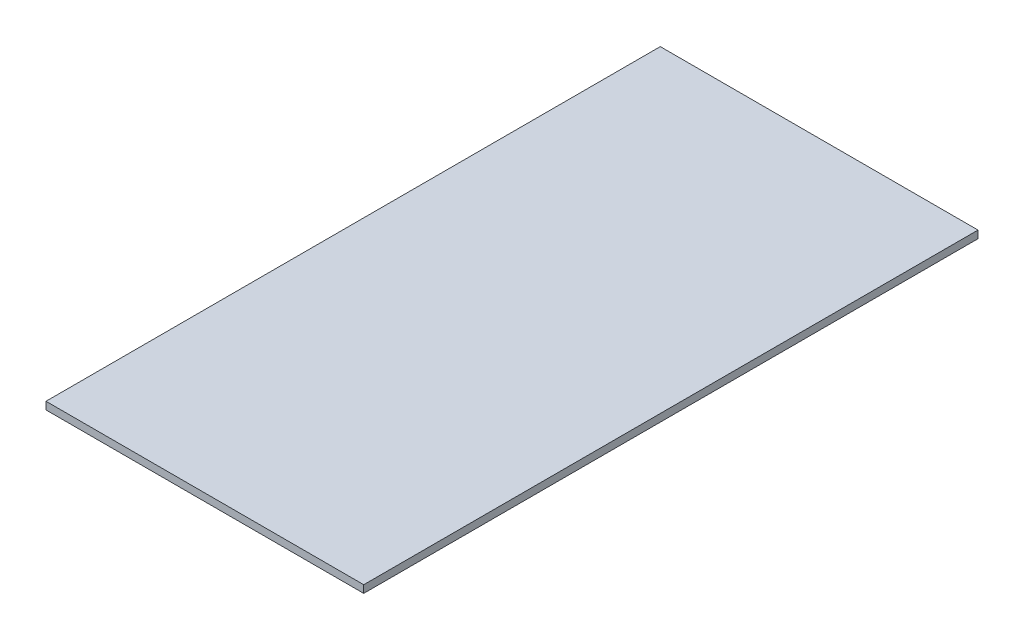
ISO-10303-21;
HEADER;
FILE_DESCRIPTION(('STEP AP214'),'2;1');
FILE_NAME('part.step','',(''),(''),'','','');
FILE_SCHEMA(('AUTOMOTIVE_DESIGN { 1 0 10303 214 1 1 1 1 }'));
ENDSEC;
DATA;
#1=APPLICATION_CONTEXT('core data for automotive mechanical design processes');
#2=APPLICATION_PROTOCOL_DEFINITION('international standard','automotive_design',2000,#1);
#3=PRODUCT_CONTEXT('',#1,'mechanical');
#4=PRODUCT('Part','Part','',(#3));
#5=PRODUCT_RELATED_PRODUCT_CATEGORY('part','',(#4));
#6=PRODUCT_DEFINITION_FORMATION('','',#4);
#7=PRODUCT_DEFINITION_CONTEXT('part definition',#1,'design');
#8=PRODUCT_DEFINITION('design','',#6,#7);
#9=PRODUCT_DEFINITION_SHAPE('','',#8);
#10=(LENGTH_UNIT() NAMED_UNIT(*) SI_UNIT(.MILLI.,.METRE.));
#11=(NAMED_UNIT(*) PLANE_ANGLE_UNIT() SI_UNIT($,.RADIAN.));
#12=(NAMED_UNIT(*) SI_UNIT($,.STERADIAN.) SOLID_ANGLE_UNIT());
#13=UNCERTAINTY_MEASURE_WITH_UNIT(LENGTH_MEASURE(1.E-05),#10,'distance_accuracy_value','');
#14=(GEOMETRIC_REPRESENTATION_CONTEXT(3) GLOBAL_UNCERTAINTY_ASSIGNED_CONTEXT((#13)) GLOBAL_UNIT_ASSIGNED_CONTEXT((#10,
#11,#12)) REPRESENTATION_CONTEXT('',''));
#15=CARTESIAN_POINT('',(0.,0.,0.));
#16=DIRECTION('',(0.,0.,1.));
#17=DIRECTION('',(1.,0.,0.));
#18=AXIS2_PLACEMENT_3D('',#15,#16,#17);
#19=CARTESIAN_POINT('',(150.,7.112,0.));
#20=DIRECTION('',(-1.,0.,0.));
#21=DIRECTION('',(0.,0.,1.));
#22=AXIS2_PLACEMENT_3D('',#19,#20,#21);
#23=PLANE('',#22);
#24=DIRECTION('',(0.,0.,-1.));
#25=VECTOR('',#24,1.);
#26=CARTESIAN_POINT('',(150.,0.,0.));
#27=LINE('',#26,#25);
#28=CARTESIAN_POINT('',(150.,0.,0.));
#29=VERTEX_POINT('',#28);
#30=CARTESIAN_POINT('',(150.,0.,-580.));
#31=VERTEX_POINT('',#30);
#32=EDGE_CURVE('E100',#29,#31,#27,.T.);
#33=ORIENTED_EDGE('',*,*,#32,.T.);
#34=DIRECTION('',(0.,-1.,0.));
#35=VECTOR('',#34,1.);
#36=CARTESIAN_POINT('',(150.,7.112,-580.));
#37=LINE('',#36,#35);
#38=CARTESIAN_POINT('',(150.,7.112,-580.));
#39=VERTEX_POINT('',#38);
#40=EDGE_CURVE('E11',#39,#31,#37,.T.);
#41=ORIENTED_EDGE('',*,*,#40,.F.);
#42=DIRECTION('',(0.,0.,-1.));
#43=VECTOR('',#42,1.);
#44=CARTESIAN_POINT('',(150.,7.112,0.));
#45=LINE('',#44,#43);
#46=CARTESIAN_POINT('',(150.,7.112,0.));
#47=VERTEX_POINT('',#46);
#48=EDGE_CURVE('E88',#47,#39,#45,.T.);
#49=ORIENTED_EDGE('',*,*,#48,.F.);
#50=DIRECTION('',(0.,-1.,0.));
#51=VECTOR('',#50,1.);
#52=CARTESIAN_POINT('',(150.,7.112,0.));
#53=LINE('',#52,#51);
#54=EDGE_CURVE('E96',#47,#29,#53,.T.);
#55=ORIENTED_EDGE('',*,*,#54,.T.);
#56=EDGE_LOOP('',(#33,#41,#49,#55));
#57=FACE_BOUND('',#56,.T.);
#58=ADVANCED_FACE('F37',(#57),#23,.F.);
#59=CARTESIAN_POINT('',(150.,7.112,-580.));
#60=DIRECTION('',(0.,0.,1.));
#61=DIRECTION('',(1.,0.,0.));
#62=AXIS2_PLACEMENT_3D('',#59,#60,#61);
#63=PLANE('',#62);
#64=DIRECTION('',(-1.,0.,0.));
#65=VECTOR('',#64,1.);
#66=CARTESIAN_POINT('',(150.,0.,-580.));
#67=LINE('',#66,#65);
#68=CARTESIAN_POINT('',(-150.,0.,-580.));
#69=VERTEX_POINT('',#68);
#70=EDGE_CURVE('E92',#31,#69,#67,.T.);
#71=ORIENTED_EDGE('',*,*,#70,.T.);
#72=DIRECTION('',(0.,-1.,0.));
#73=VECTOR('',#72,1.);
#74=CARTESIAN_POINT('',(-150.,7.112,-580.));
#75=LINE('',#74,#73);
#76=CARTESIAN_POINT('',(-150.,7.112,-580.));
#77=VERTEX_POINT('',#76);
#78=EDGE_CURVE('E45',#77,#69,#75,.T.);
#79=ORIENTED_EDGE('',*,*,#78,.F.);
#80=DIRECTION('',(-1.,0.,0.));
#81=VECTOR('',#80,1.);
#82=CARTESIAN_POINT('',(150.,7.112,-580.));
#83=LINE('',#82,#81);
#84=EDGE_CURVE('E83',#39,#77,#83,.T.);
#85=ORIENTED_EDGE('',*,*,#84,.F.);
#86=ORIENTED_EDGE('',*,*,#40,.T.);
#87=EDGE_LOOP('',(#71,#79,#85,#86));
#88=FACE_BOUND('',#87,.T.);
#89=ADVANCED_FACE('F91',(#88),#63,.F.);
#90=CARTESIAN_POINT('',(-150.,7.112,0.));
#91=DIRECTION('',(1.,0.,0.));
#92=DIRECTION('',(0.,0.,-1.));
#93=AXIS2_PLACEMENT_3D('',#90,#91,#92);
#94=PLANE('',#93);
#95=DIRECTION('',(0.,0.,1.));
#96=VECTOR('',#95,1.);
#97=CARTESIAN_POINT('',(-150.,0.,0.));
#98=LINE('',#97,#96);
#99=CARTESIAN_POINT('',(-150.,0.,0.));
#100=VERTEX_POINT('',#99);
#101=EDGE_CURVE('E70',#69,#100,#98,.T.);
#102=ORIENTED_EDGE('',*,*,#101,.T.);
#103=DIRECTION('',(0.,-1.,0.));
#104=VECTOR('',#103,1.);
#105=CARTESIAN_POINT('',(-150.,7.112,0.));
#106=LINE('',#105,#104);
#107=CARTESIAN_POINT('',(-150.,7.112,0.));
#108=VERTEX_POINT('',#107);
#109=EDGE_CURVE('E93',#108,#100,#106,.T.);
#110=ORIENTED_EDGE('',*,*,#109,.F.);
#111=DIRECTION('',(0.,0.,1.));
#112=VECTOR('',#111,1.);
#113=CARTESIAN_POINT('',(-150.,7.112,0.));
#114=LINE('',#113,#112);
#115=EDGE_CURVE('E86',#77,#108,#114,.T.);
#116=ORIENTED_EDGE('',*,*,#115,.F.);
#117=ORIENTED_EDGE('',*,*,#78,.T.);
#118=EDGE_LOOP('',(#102,#110,#116,#117));
#119=FACE_BOUND('',#118,.T.);
#120=ADVANCED_FACE('F94',(#119),#94,.F.);
#121=CARTESIAN_POINT('',(150.,7.112,0.));
#122=DIRECTION('',(0.,0.,-1.));
#123=DIRECTION('',(-1.,0.,0.));
#124=AXIS2_PLACEMENT_3D('',#121,#122,#123);
#125=PLANE('',#124);
#126=DIRECTION('',(1.,0.,0.));
#127=VECTOR('',#126,1.);
#128=CARTESIAN_POINT('',(150.,0.,0.));
#129=LINE('',#128,#127);
#130=EDGE_CURVE('E76',#100,#29,#129,.T.);
#131=ORIENTED_EDGE('',*,*,#130,.T.);
#132=ORIENTED_EDGE('',*,*,#54,.F.);
#133=DIRECTION('',(1.,0.,0.));
#134=VECTOR('',#133,1.);
#135=CARTESIAN_POINT('',(150.,7.112,0.));
#136=LINE('',#135,#134);
#137=EDGE_CURVE('E53',#108,#47,#136,.T.);
#138=ORIENTED_EDGE('',*,*,#137,.F.);
#139=ORIENTED_EDGE('',*,*,#109,.T.);
#140=EDGE_LOOP('',(#131,#132,#138,#139));
#141=FACE_BOUND('',#140,.T.);
#142=ADVANCED_FACE('F107',(#141),#125,.F.);
#143=CARTESIAN_POINT('',(0.,7.112,0.));
#144=DIRECTION('',(0.,1.,0.));
#145=DIRECTION('',(0.,0.,1.));
#146=AXIS2_PLACEMENT_3D('',#143,#144,#145);
#147=PLANE('',#146);
#148=ORIENTED_EDGE('',*,*,#48,.T.);
#149=ORIENTED_EDGE('',*,*,#84,.T.);
#150=ORIENTED_EDGE('',*,*,#115,.T.);
#151=ORIENTED_EDGE('',*,*,#137,.T.);
#152=EDGE_LOOP('',(#148,#149,#150,#151));
#153=FACE_BOUND('',#152,.T.);
#154=ADVANCED_FACE('F84',(#153),#147,.T.);
#155=CARTESIAN_POINT('',(0.,0.,0.));
#156=DIRECTION('',(0.,1.,0.));
#157=DIRECTION('',(0.,0.,1.));
#158=AXIS2_PLACEMENT_3D('',#155,#156,#157);
#159=PLANE('',#158);
#160=ORIENTED_EDGE('',*,*,#32,.F.);
#161=ORIENTED_EDGE('',*,*,#130,.F.);
#162=ORIENTED_EDGE('',*,*,#101,.F.);
#163=ORIENTED_EDGE('',*,*,#70,.F.);
#164=EDGE_LOOP('',(#160,#161,#162,#163));
#165=FACE_BOUND('',#164,.T.);
#166=ADVANCED_FACE('F110',(#165),#159,.F.);
#167=CLOSED_SHELL('',(#58,#89,#120,#142,#154,#166));
#168=MANIFOLD_SOLID_BREP('B2',#167);
#169=ADVANCED_BREP_SHAPE_REPRESENTATION('',(#18,#168),#14);
#170=SHAPE_DEFINITION_REPRESENTATION(#9,#169);
ENDSEC;
END-ISO-10303-21;
